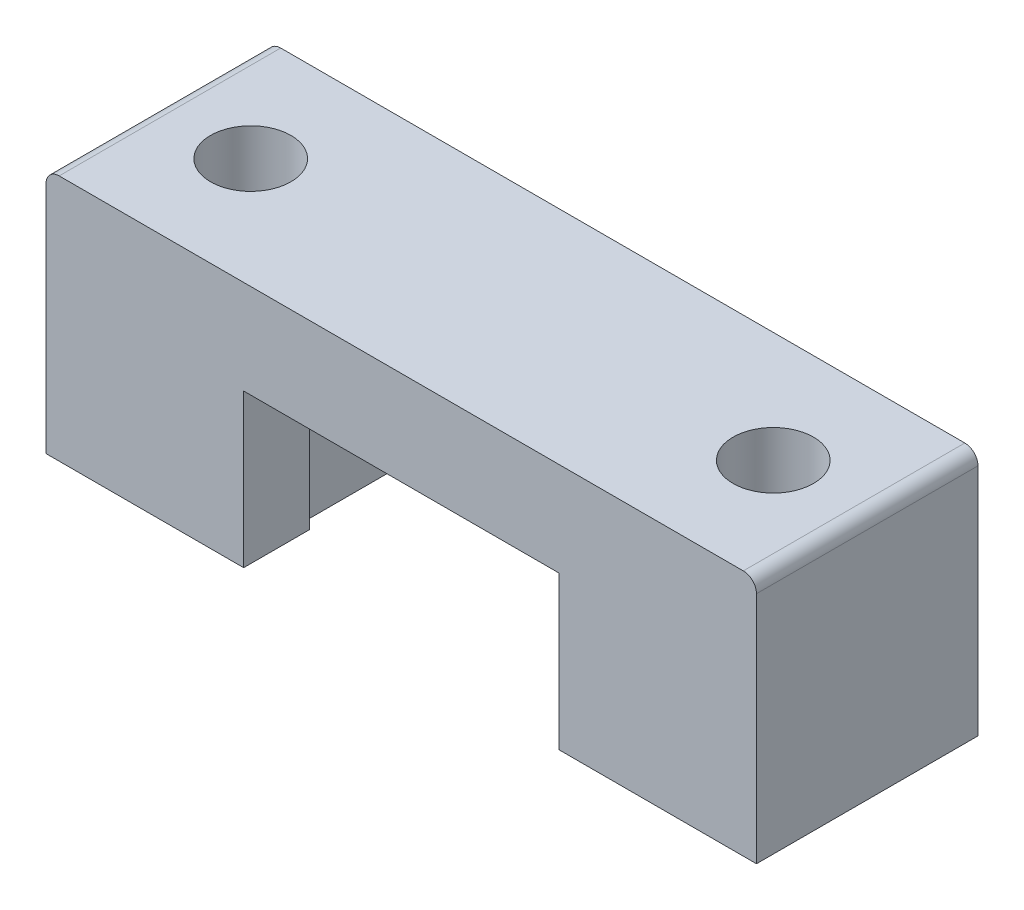
ISO-10303-21;
HEADER;
FILE_DESCRIPTION(('STEP AP214'),'2;1');
FILE_NAME('part.step','',(''),(''),'','','');
FILE_SCHEMA(('AUTOMOTIVE_DESIGN { 1 0 10303 214 1 1 1 1 }'));
ENDSEC;
DATA;
#1=APPLICATION_CONTEXT('core data for automotive mechanical design processes');
#2=APPLICATION_PROTOCOL_DEFINITION('international standard','automotive_design',2000,#1);
#3=PRODUCT_CONTEXT('',#1,'mechanical');
#4=PRODUCT('Part','Part','',(#3));
#5=PRODUCT_RELATED_PRODUCT_CATEGORY('part','',(#4));
#6=PRODUCT_DEFINITION_FORMATION('','',#4);
#7=PRODUCT_DEFINITION_CONTEXT('part definition',#1,'design');
#8=PRODUCT_DEFINITION('design','',#6,#7);
#9=PRODUCT_DEFINITION_SHAPE('','',#8);
#10=(LENGTH_UNIT() NAMED_UNIT(*) SI_UNIT(.MILLI.,.METRE.));
#11=(NAMED_UNIT(*) PLANE_ANGLE_UNIT() SI_UNIT($,.RADIAN.));
#12=(NAMED_UNIT(*) SI_UNIT($,.STERADIAN.) SOLID_ANGLE_UNIT());
#13=UNCERTAINTY_MEASURE_WITH_UNIT(LENGTH_MEASURE(1.E-05),#10,'distance_accuracy_value','');
#14=(GEOMETRIC_REPRESENTATION_CONTEXT(3) GLOBAL_UNCERTAINTY_ASSIGNED_CONTEXT((#13)) GLOBAL_UNIT_ASSIGNED_CONTEXT((#10,
#11,#12)) REPRESENTATION_CONTEXT('',''));
#15=CARTESIAN_POINT('',(0.,0.,0.));
#16=DIRECTION('',(0.,0.,1.));
#17=DIRECTION('',(1.,0.,0.));
#18=AXIS2_PLACEMENT_3D('',#15,#16,#17);
#19=CARTESIAN_POINT('',(0.,9.525,0.));
#20=DIRECTION('',(0.,0.,1.));
#21=DIRECTION('',(1.,0.,0.));
#22=AXIS2_PLACEMENT_3D('',#19,#20,#21);
#23=PLANE('',#22);
#24=DIRECTION('',(0.,-1.,0.));
#25=VECTOR('',#24,1.);
#26=CARTESIAN_POINT('',(-7.245,9.525,0.));
#27=LINE('',#26,#25);
#28=CARTESIAN_POINT('',(-7.245,9.017,0.));
#29=VERTEX_POINT('',#28);
#30=CARTESIAN_POINT('',(-7.245,0.,0.));
#31=VERTEX_POINT('',#30);
#32=EDGE_CURVE('E229',#29,#31,#27,.T.);
#33=ORIENTED_EDGE('',*,*,#32,.F.);
#34=CARTESIAN_POINT('',(-6.737,9.017,0.));
#35=DIRECTION('',(0.,0.,1.));
#36=DIRECTION('',(1.,0.,0.));
#37=AXIS2_PLACEMENT_3D('',#34,#35,#36);
#38=CIRCLE('',#37,0.508);
#39=CARTESIAN_POINT('',(-6.737,9.525,0.));
#40=VERTEX_POINT('',#39);
#41=EDGE_CURVE('E55',#29,#40,#38,.F.);
#42=ORIENTED_EDGE('',*,*,#41,.T.);
#43=DIRECTION('',(-1.,0.,0.));
#44=VECTOR('',#43,1.);
#45=CARTESIAN_POINT('',(0.,9.525,0.));
#46=LINE('',#45,#44);
#47=CARTESIAN_POINT('',(19.637,9.525,0.));
#48=VERTEX_POINT('',#47);
#49=EDGE_CURVE('E188',#48,#40,#46,.T.);
#50=ORIENTED_EDGE('',*,*,#49,.F.);
#51=CARTESIAN_POINT('',(19.637,9.017,0.));
#52=DIRECTION('',(0.,0.,1.));
#53=DIRECTION('',(1.,0.,0.));
#54=AXIS2_PLACEMENT_3D('',#51,#52,#53);
#55=CIRCLE('',#54,0.508);
#56=CARTESIAN_POINT('',(20.145,9.017,0.));
#57=VERTEX_POINT('',#56);
#58=EDGE_CURVE('E62',#48,#57,#55,.F.);
#59=ORIENTED_EDGE('',*,*,#58,.T.);
#60=DIRECTION('',(0.,-1.,0.));
#61=VECTOR('',#60,1.);
#62=CARTESIAN_POINT('',(20.145,9.525,0.));
#63=LINE('',#62,#61);
#64=CARTESIAN_POINT('',(20.145,0.,0.));
#65=VERTEX_POINT('',#64);
#66=EDGE_CURVE('E232',#57,#65,#63,.T.);
#67=ORIENTED_EDGE('',*,*,#66,.T.);
#68=DIRECTION('',(-1.,0.,0.));
#69=VECTOR('',#68,1.);
#70=CARTESIAN_POINT('',(0.,0.,0.));
#71=LINE('',#70,#69);
#72=CARTESIAN_POINT('',(12.9,0.,0.));
#73=VERTEX_POINT('',#72);
#74=EDGE_CURVE('E174',#65,#73,#71,.T.);
#75=ORIENTED_EDGE('',*,*,#74,.T.);
#76=DIRECTION('',(0.,-1.,0.));
#77=VECTOR('',#76,1.);
#78=CARTESIAN_POINT('',(12.9,5.9,0.));
#79=LINE('',#78,#77);
#80=CARTESIAN_POINT('',(12.9,5.9,0.));
#81=VERTEX_POINT('',#80);
#82=EDGE_CURVE('E165',#81,#73,#79,.T.);
#83=ORIENTED_EDGE('',*,*,#82,.F.);
#84=DIRECTION('',(-1.,0.,0.));
#85=VECTOR('',#84,1.);
#86=CARTESIAN_POINT('',(0.,5.9,0.));
#87=LINE('',#86,#85);
#88=CARTESIAN_POINT('',(0.,5.9,0.));
#89=VERTEX_POINT('',#88);
#90=EDGE_CURVE('E151',#81,#89,#87,.T.);
#91=ORIENTED_EDGE('',*,*,#90,.T.);
#92=DIRECTION('',(0.,-1.,0.));
#93=VECTOR('',#92,1.);
#94=CARTESIAN_POINT('',(0.,5.9,0.));
#95=LINE('',#94,#93);
#96=CARTESIAN_POINT('',(0.,0.,0.));
#97=VERTEX_POINT('',#96);
#98=EDGE_CURVE('E177',#89,#97,#95,.T.);
#99=ORIENTED_EDGE('',*,*,#98,.T.);
#100=EDGE_CURVE('E182',#97,#31,#71,.T.);
#101=ORIENTED_EDGE('',*,*,#100,.T.);
#102=EDGE_LOOP('',(#33,#42,#50,#59,#67,#75,#83,#91,#99,#101));
#103=FACE_BOUND('',#102,.T.);
#104=ADVANCED_FACE('F46',(#103),#23,.F.);
#105=CARTESIAN_POINT('',(0.,9.525,8.54));
#106=DIRECTION('',(0.,0.,-1.));
#107=DIRECTION('',(-1.,0.,0.));
#108=AXIS2_PLACEMENT_3D('',#105,#106,#107);
#109=PLANE('',#108);
#110=DIRECTION('',(1.,0.,0.));
#111=VECTOR('',#110,1.);
#112=CARTESIAN_POINT('',(0.,9.525,8.54));
#113=LINE('',#112,#111);
#114=CARTESIAN_POINT('',(-6.737,9.525,8.54));
#115=VERTEX_POINT('',#114);
#116=CARTESIAN_POINT('',(19.637,9.525,8.54));
#117=VERTEX_POINT('',#116);
#118=EDGE_CURVE('E192',#115,#117,#113,.T.);
#119=ORIENTED_EDGE('',*,*,#118,.F.);
#120=CARTESIAN_POINT('',(-6.737,9.017,8.54));
#121=DIRECTION('',(0.,0.,-1.));
#122=DIRECTION('',(-1.,0.,0.));
#123=AXIS2_PLACEMENT_3D('',#120,#121,#122);
#124=CIRCLE('',#123,0.508);
#125=CARTESIAN_POINT('',(-7.245,9.017,8.54));
#126=VERTEX_POINT('',#125);
#127=EDGE_CURVE('E245',#115,#126,#124,.F.);
#128=ORIENTED_EDGE('',*,*,#127,.T.);
#129=DIRECTION('',(0.,-1.,0.));
#130=VECTOR('',#129,1.);
#131=CARTESIAN_POINT('',(-7.245,9.525,8.54));
#132=LINE('',#131,#130);
#133=CARTESIAN_POINT('',(-7.245,0.,8.54));
#134=VERTEX_POINT('',#133);
#135=EDGE_CURVE('E226',#126,#134,#132,.T.);
#136=ORIENTED_EDGE('',*,*,#135,.T.);
#137=DIRECTION('',(1.,0.,0.));
#138=VECTOR('',#137,1.);
#139=CARTESIAN_POINT('',(0.,0.,8.54));
#140=LINE('',#139,#138);
#141=CARTESIAN_POINT('',(0.375000000000001,0.,8.54));
#142=VERTEX_POINT('',#141);
#143=EDGE_CURVE('E213',#134,#142,#140,.T.);
#144=ORIENTED_EDGE('',*,*,#143,.T.);
#145=DIRECTION('',(0.,-1.,0.));
#146=VECTOR('',#145,1.);
#147=CARTESIAN_POINT('',(0.375000000000001,5.9,8.54));
#148=LINE('',#147,#146);
#149=CARTESIAN_POINT('',(0.375000000000001,5.9,8.54));
#150=VERTEX_POINT('',#149);
#151=EDGE_CURVE('E277',#150,#142,#148,.T.);
#152=ORIENTED_EDGE('',*,*,#151,.F.);
#153=DIRECTION('',(1.,0.,0.));
#154=VECTOR('',#153,1.);
#155=CARTESIAN_POINT('',(0.,5.9,8.54));
#156=LINE('',#155,#154);
#157=CARTESIAN_POINT('',(12.525,5.9,8.54));
#158=VERTEX_POINT('',#157);
#159=EDGE_CURVE('E280',#150,#158,#156,.T.);
#160=ORIENTED_EDGE('',*,*,#159,.T.);
#161=DIRECTION('',(0.,-1.,0.));
#162=VECTOR('',#161,1.);
#163=CARTESIAN_POINT('',(12.525,5.9,8.54));
#164=LINE('',#163,#162);
#165=CARTESIAN_POINT('',(12.525,0.,8.54));
#166=VERTEX_POINT('',#165);
#167=EDGE_CURVE('E284',#158,#166,#164,.T.);
#168=ORIENTED_EDGE('',*,*,#167,.T.);
#169=CARTESIAN_POINT('',(20.145,0.,8.54));
#170=VERTEX_POINT('',#169);
#171=EDGE_CURVE('E212',#166,#170,#140,.T.);
#172=ORIENTED_EDGE('',*,*,#171,.T.);
#173=DIRECTION('',(0.,-1.,0.));
#174=VECTOR('',#173,1.);
#175=CARTESIAN_POINT('',(20.145,9.525,8.54));
#176=LINE('',#175,#174);
#177=CARTESIAN_POINT('',(20.145,9.017,8.54));
#178=VERTEX_POINT('',#177);
#179=EDGE_CURVE('E204',#178,#170,#176,.T.);
#180=ORIENTED_EDGE('',*,*,#179,.F.);
#181=CARTESIAN_POINT('',(19.637,9.017,8.54));
#182=DIRECTION('',(0.,0.,-1.));
#183=DIRECTION('',(-1.,0.,0.));
#184=AXIS2_PLACEMENT_3D('',#181,#182,#183);
#185=CIRCLE('',#184,0.508);
#186=EDGE_CURVE('E242',#178,#117,#185,.F.);
#187=ORIENTED_EDGE('',*,*,#186,.T.);
#188=EDGE_LOOP('',(#119,#128,#136,#144,#152,#160,#168,#172,#180,#187));
#189=FACE_BOUND('',#188,.T.);
#190=ADVANCED_FACE('F263',(#189),#109,.F.);
#191=CARTESIAN_POINT('',(0.,0.,0.));
#192=DIRECTION('',(0.,1.,0.));
#193=DIRECTION('',(0.,0.,1.));
#194=AXIS2_PLACEMENT_3D('',#191,#192,#193);
#195=PLANE('',#194);
#196=CARTESIAN_POINT('',(-3.6225,0.,4.27));
#197=DIRECTION('',(0.,1.,0.));
#198=DIRECTION('',(0.,0.,1.));
#199=AXIS2_PLACEMENT_3D('',#196,#197,#198);
#200=CIRCLE('',#199,1.55);
#201=CARTESIAN_POINT('',(-3.6225,0.,2.72));
#202=VERTEX_POINT('',#201);
#203=EDGE_CURVE('E217',#202,#202,#200,.T.);
#204=ORIENTED_EDGE('',*,*,#203,.T.);
#205=EDGE_LOOP('',(#204));
#206=FACE_BOUND('',#205,.T.);
#207=DIRECTION('',(0.,0.,1.));
#208=VECTOR('',#207,1.);
#209=CARTESIAN_POINT('',(0.,0.,0.));
#210=LINE('',#209,#208);
#211=CARTESIAN_POINT('',(0.,0.,6.));
#212=VERTEX_POINT('',#211);
#213=EDGE_CURVE('E297',#97,#212,#210,.T.);
#214=ORIENTED_EDGE('',*,*,#213,.T.);
#215=DIRECTION('',(1.,0.,0.));
#216=VECTOR('',#215,1.);
#217=CARTESIAN_POINT('',(0.,0.,6.));
#218=LINE('',#217,#216);
#219=CARTESIAN_POINT('',(0.375000000000001,0.,6.));
#220=VERTEX_POINT('',#219);
#221=EDGE_CURVE('E299',#212,#220,#218,.T.);
#222=ORIENTED_EDGE('',*,*,#221,.T.);
#223=DIRECTION('',(0.,0.,1.));
#224=VECTOR('',#223,1.);
#225=CARTESIAN_POINT('',(0.375,0.,0.));
#226=LINE('',#225,#224);
#227=EDGE_CURVE('E274',#220,#142,#226,.T.);
#228=ORIENTED_EDGE('',*,*,#227,.T.);
#229=ORIENTED_EDGE('',*,*,#143,.F.);
#230=DIRECTION('',(0.,0.,1.));
#231=VECTOR('',#230,1.);
#232=CARTESIAN_POINT('',(-7.245,0.,0.));
#233=LINE('',#232,#231);
#234=EDGE_CURVE('E208',#31,#134,#233,.T.);
#235=ORIENTED_EDGE('',*,*,#234,.F.);
#236=ORIENTED_EDGE('',*,*,#100,.F.);
#237=EDGE_LOOP('',(#214,#222,#228,#229,#235,#236));
#238=FACE_BOUND('',#237,.T.);
#239=ADVANCED_FACE('F271',(#206,#238),#195,.F.);
#240=CARTESIAN_POINT('',(16.5225,0.,4.27));
#241=DIRECTION('',(0.,1.,0.));
#242=DIRECTION('',(0.,0.,1.));
#243=AXIS2_PLACEMENT_3D('',#240,#241,#242);
#244=CIRCLE('',#243,1.55);
#245=CARTESIAN_POINT('',(16.5225,0.,2.72));
#246=VERTEX_POINT('',#245);
#247=EDGE_CURVE('E193',#246,#246,#244,.T.);
#248=ORIENTED_EDGE('',*,*,#247,.T.);
#249=EDGE_LOOP('',(#248));
#250=FACE_BOUND('',#249,.T.);
#251=DIRECTION('',(0.,0.,-1.));
#252=VECTOR('',#251,1.);
#253=CARTESIAN_POINT('',(12.9,0.,0.));
#254=LINE('',#253,#252);
#255=CARTESIAN_POINT('',(12.9,0.,6.));
#256=VERTEX_POINT('',#255);
#257=EDGE_CURVE('E305',#256,#73,#254,.T.);
#258=ORIENTED_EDGE('',*,*,#257,.T.);
#259=ORIENTED_EDGE('',*,*,#74,.F.);
#260=DIRECTION('',(0.,0.,1.));
#261=VECTOR('',#260,1.);
#262=CARTESIAN_POINT('',(20.145,0.,0.));
#263=LINE('',#262,#261);
#264=EDGE_CURVE('E176',#65,#170,#263,.T.);
#265=ORIENTED_EDGE('',*,*,#264,.T.);
#266=ORIENTED_EDGE('',*,*,#171,.F.);
#267=DIRECTION('',(0.,0.,-1.));
#268=VECTOR('',#267,1.);
#269=CARTESIAN_POINT('',(12.525,0.,0.));
#270=LINE('',#269,#268);
#271=CARTESIAN_POINT('',(12.525,0.,6.));
#272=VERTEX_POINT('',#271);
#273=EDGE_CURVE('E313',#166,#272,#270,.T.);
#274=ORIENTED_EDGE('',*,*,#273,.T.);
#275=DIRECTION('',(1.,0.,0.));
#276=VECTOR('',#275,1.);
#277=CARTESIAN_POINT('',(0.,0.,6.00000000000006));
#278=LINE('',#277,#276);
#279=EDGE_CURVE('E170',#272,#256,#278,.T.);
#280=ORIENTED_EDGE('',*,*,#279,.T.);
#281=EDGE_LOOP('',(#258,#259,#265,#266,#274,#280));
#282=FACE_BOUND('',#281,.T.);
#283=ADVANCED_FACE('F333',(#250,#282),#195,.F.);
#284=CARTESIAN_POINT('',(20.145,9.525,0.));
#285=DIRECTION('',(1.,0.,0.));
#286=DIRECTION('',(0.,0.,-1.));
#287=AXIS2_PLACEMENT_3D('',#284,#285,#286);
#288=PLANE('',#287);
#289=ORIENTED_EDGE('',*,*,#66,.F.);
#290=DIRECTION('',(0.,0.,1.));
#291=VECTOR('',#290,1.);
#292=CARTESIAN_POINT('',(20.145,9.017,0.));
#293=LINE('',#292,#291);
#294=EDGE_CURVE('E11',#57,#178,#293,.T.);
#295=ORIENTED_EDGE('',*,*,#294,.T.);
#296=ORIENTED_EDGE('',*,*,#179,.T.);
#297=ORIENTED_EDGE('',*,*,#264,.F.);
#298=EDGE_LOOP('',(#289,#295,#296,#297));
#299=FACE_BOUND('',#298,.T.);
#300=ADVANCED_FACE('F371',(#299),#288,.T.);
#301=CARTESIAN_POINT('',(-7.245,9.525,0.));
#302=DIRECTION('',(1.,0.,0.));
#303=DIRECTION('',(0.,0.,-1.));
#304=AXIS2_PLACEMENT_3D('',#301,#302,#303);
#305=PLANE('',#304);
#306=ORIENTED_EDGE('',*,*,#135,.F.);
#307=DIRECTION('',(0.,0.,1.));
#308=VECTOR('',#307,1.);
#309=CARTESIAN_POINT('',(-7.245,9.017,0.));
#310=LINE('',#309,#308);
#311=EDGE_CURVE('E70',#126,#29,#310,.F.);
#312=ORIENTED_EDGE('',*,*,#311,.T.);
#313=ORIENTED_EDGE('',*,*,#32,.T.);
#314=ORIENTED_EDGE('',*,*,#234,.T.);
#315=EDGE_LOOP('',(#306,#312,#313,#314));
#316=FACE_BOUND('',#315,.T.);
#317=ADVANCED_FACE('F264',(#316),#305,.F.);
#318=CARTESIAN_POINT('',(-3.6225,9.525,4.27));
#319=DIRECTION('',(0.,-1.,0.));
#320=DIRECTION('',(0.,0.,-1.));
#321=AXIS2_PLACEMENT_3D('',#318,#319,#320);
#322=CYLINDRICAL_SURFACE('',#321,1.55);
#323=CARTESIAN_POINT('',(-3.6225,9.525,4.27));
#324=DIRECTION('',(0.,1.,0.));
#325=DIRECTION('',(0.,0.,1.));
#326=AXIS2_PLACEMENT_3D('',#323,#324,#325);
#327=CIRCLE('',#326,1.55);
#328=CARTESIAN_POINT('',(-3.6225,9.525,2.72));
#329=VERTEX_POINT('',#328);
#330=EDGE_CURVE('E197',#329,#329,#327,.T.);
#331=CARTESIAN_POINT('',(-3.6225,9.525,2.72));
#332=CARTESIAN_POINT('',(-3.6225,9.42578125,2.72));
#333=CARTESIAN_POINT('',(-3.6225,9.3265625,2.72));
#334=CARTESIAN_POINT('',(-3.6225,9.128125,2.72));
#335=CARTESIAN_POINT('',(-3.6225,9.02890625,2.72));
#336=CARTESIAN_POINT('',(-3.6225,8.83046875,2.72));
#337=CARTESIAN_POINT('',(-3.6225,8.73125,2.72));
#338=CARTESIAN_POINT('',(-3.6225,8.5328125,2.72));
#339=CARTESIAN_POINT('',(-3.6225,8.43359375,2.72));
#340=CARTESIAN_POINT('',(-3.6225,8.23515625,2.72));
#341=CARTESIAN_POINT('',(-3.6225,8.1359375,2.72));
#342=CARTESIAN_POINT('',(-3.6225,7.9375,2.72));
#343=CARTESIAN_POINT('',(-3.6225,7.83828125,2.72));
#344=CARTESIAN_POINT('',(-3.6225,7.63984375,2.72));
#345=CARTESIAN_POINT('',(-3.6225,7.540625,2.72));
#346=CARTESIAN_POINT('',(-3.6225,7.3421875,2.72));
#347=CARTESIAN_POINT('',(-3.6225,7.24296875,2.72));
#348=CARTESIAN_POINT('',(-3.6225,7.04453125,2.72));
#349=CARTESIAN_POINT('',(-3.6225,6.9453125,2.72));
#350=CARTESIAN_POINT('',(-3.6225,6.746875,2.72));
#351=CARTESIAN_POINT('',(-3.6225,6.64765625,2.72));
#352=CARTESIAN_POINT('',(-3.6225,6.44921875,2.72));
#353=CARTESIAN_POINT('',(-3.6225,6.35,2.72));
#354=CARTESIAN_POINT('',(-3.6225,6.1515625,2.72));
#355=CARTESIAN_POINT('',(-3.6225,6.05234375,2.72));
#356=CARTESIAN_POINT('',(-3.6225,5.85390625,2.72));
#357=CARTESIAN_POINT('',(-3.6225,5.7546875,2.72));
#358=CARTESIAN_POINT('',(-3.6225,5.55625,2.72));
#359=CARTESIAN_POINT('',(-3.6225,5.45703125,2.72));
#360=CARTESIAN_POINT('',(-3.6225,5.25859375,2.72));
#361=CARTESIAN_POINT('',(-3.6225,5.159375,2.72));
#362=CARTESIAN_POINT('',(-3.6225,4.9609375,2.72));
#363=CARTESIAN_POINT('',(-3.6225,4.86171875,2.72));
#364=CARTESIAN_POINT('',(-3.6225,4.66328125,2.72));
#365=CARTESIAN_POINT('',(-3.6225,4.5640625,2.72));
#366=CARTESIAN_POINT('',(-3.6225,4.365625,2.72));
#367=CARTESIAN_POINT('',(-3.6225,4.26640625,2.72));
#368=CARTESIAN_POINT('',(-3.6225,4.06796875,2.72));
#369=CARTESIAN_POINT('',(-3.6225,3.96875,2.72));
#370=CARTESIAN_POINT('',(-3.6225,3.7703125,2.72));
#371=CARTESIAN_POINT('',(-3.6225,3.67109375,2.72));
#372=CARTESIAN_POINT('',(-3.6225,3.47265625,2.72));
#373=CARTESIAN_POINT('',(-3.6225,3.3734375,2.72));
#374=CARTESIAN_POINT('',(-3.6225,3.175,2.72));
#375=CARTESIAN_POINT('',(-3.6225,3.07578125,2.72));
#376=CARTESIAN_POINT('',(-3.6225,2.87734375,2.72));
#377=CARTESIAN_POINT('',(-3.6225,2.778125,2.72));
#378=CARTESIAN_POINT('',(-3.6225,2.5796875,2.72));
#379=CARTESIAN_POINT('',(-3.6225,2.48046875,2.72));
#380=CARTESIAN_POINT('',(-3.6225,2.28203125,2.72));
#381=CARTESIAN_POINT('',(-3.6225,2.1828125,2.72));
#382=CARTESIAN_POINT('',(-3.6225,1.984375,2.72));
#383=CARTESIAN_POINT('',(-3.6225,1.88515625,2.72));
#384=CARTESIAN_POINT('',(-3.6225,1.68671875,2.72));
#385=CARTESIAN_POINT('',(-3.6225,1.5875,2.72));
#386=CARTESIAN_POINT('',(-3.6225,1.3890625,2.72));
#387=CARTESIAN_POINT('',(-3.6225,1.28984375,2.72));
#388=CARTESIAN_POINT('',(-3.6225,1.09140625,2.72));
#389=CARTESIAN_POINT('',(-3.6225,0.992187500000001,2.72));
#390=CARTESIAN_POINT('',(-3.6225,0.793750000000001,2.72));
#391=CARTESIAN_POINT('',(-3.6225,0.69453125,2.72));
#392=CARTESIAN_POINT('',(-3.6225,0.49609375,2.72));
#393=CARTESIAN_POINT('',(-3.6225,0.396875,2.72));
#394=CARTESIAN_POINT('',(-3.6225,0.1984375,2.72));
#395=CARTESIAN_POINT('',(-3.6225,0.0992187500000001,2.72));
#396=CARTESIAN_POINT('',(-3.6225,0.,2.72));
#397=B_SPLINE_CURVE_WITH_KNOTS('',3,(#331,#332,#333,#334,#335,#336,#337,#338,#339,#340,#341,
#342,#343,#344,#345,#346,#347,#348,#349,#350,#351,#352,#353,#354,#355,#356,#357,#358,#359,#360,
#361,#362,#363,#364,#365,#366,#367,#368,#369,#370,#371,#372,#373,#374,#375,#376,#377,#378,#379,
#380,#381,#382,#383,#384,#385,#386,#387,#388,#389,#390,#391,#392,#393,#394,#395,#396),
.UNSPECIFIED.,.F.,.F.,(4,2,2,2,2,2,2,2,2,2,2,2,2,2,2,2,2,2,2,2,2,2,2,2,2,2,2,2,2,2,2,2,4),(0.,
0.297656249999998,0.595312499999999,0.892968749999999,1.190625,1.48828125,1.7859375,2.08359375,
2.38125,2.67890625,2.9765625,3.27421875,3.571875,3.86953125,4.1671875,4.46484375,4.7625,
5.06015625,5.3578125,5.65546875,5.953125,6.25078125,6.5484375,6.84609375,7.14375,7.44140625,
7.7390625,8.03671875,8.334375,8.63203125,8.9296875,9.22734375,9.525),.UNSPECIFIED.);
#398=EDGE_CURVE('BSEAM471',#329,#202,#397,.T.);
#399=ORIENTED_EDGE('',*,*,#330,.T.);
#400=ORIENTED_EDGE('',*,*,#203,.F.);
#401=ORIENTED_EDGE('',*,*,#398,.T.);
#402=ORIENTED_EDGE('',*,*,#398,.F.);
#403=EDGE_LOOP('',(#399,#401,#400,#402));
#404=FACE_BOUND('',#403,.T.);
#405=ADVANCED_FACE('F471',(#404),#322,.F.);
#406=CARTESIAN_POINT('',(16.5225,9.525,4.27));
#407=DIRECTION('',(0.,-1.,0.));
#408=DIRECTION('',(0.,0.,-1.));
#409=AXIS2_PLACEMENT_3D('',#406,#407,#408);
#410=CYLINDRICAL_SURFACE('',#409,1.55);
#411=CARTESIAN_POINT('',(16.5225,9.525,4.27));
#412=DIRECTION('',(0.,1.,0.));
#413=DIRECTION('',(0.,0.,1.));
#414=AXIS2_PLACEMENT_3D('',#411,#412,#413);
#415=CIRCLE('',#414,1.55);
#416=CARTESIAN_POINT('',(16.5225,9.525,2.72));
#417=VERTEX_POINT('',#416);
#418=EDGE_CURVE('E201',#417,#417,#415,.T.);
#419=CARTESIAN_POINT('',(16.5225,9.525,2.72));
#420=CARTESIAN_POINT('',(16.5225,9.42578125,2.72));
#421=CARTESIAN_POINT('',(16.5225,9.3265625,2.72));
#422=CARTESIAN_POINT('',(16.5225,9.128125,2.72));
#423=CARTESIAN_POINT('',(16.5225,9.02890625,2.72));
#424=CARTESIAN_POINT('',(16.5225,8.83046875,2.72));
#425=CARTESIAN_POINT('',(16.5225,8.73125,2.72));
#426=CARTESIAN_POINT('',(16.5225,8.5328125,2.72));
#427=CARTESIAN_POINT('',(16.5225,8.43359375,2.72));
#428=CARTESIAN_POINT('',(16.5225,8.23515625,2.72));
#429=CARTESIAN_POINT('',(16.5225,8.1359375,2.72));
#430=CARTESIAN_POINT('',(16.5225,7.9375,2.72));
#431=CARTESIAN_POINT('',(16.5225,7.83828125,2.72));
#432=CARTESIAN_POINT('',(16.5225,7.63984375,2.72));
#433=CARTESIAN_POINT('',(16.5225,7.540625,2.72));
#434=CARTESIAN_POINT('',(16.5225,7.3421875,2.72));
#435=CARTESIAN_POINT('',(16.5225,7.24296875,2.72));
#436=CARTESIAN_POINT('',(16.5225,7.04453125,2.72));
#437=CARTESIAN_POINT('',(16.5225,6.9453125,2.72));
#438=CARTESIAN_POINT('',(16.5225,6.746875,2.72));
#439=CARTESIAN_POINT('',(16.5225,6.64765625,2.72));
#440=CARTESIAN_POINT('',(16.5225,6.44921875,2.72));
#441=CARTESIAN_POINT('',(16.5225,6.35,2.72));
#442=CARTESIAN_POINT('',(16.5225,6.1515625,2.72));
#443=CARTESIAN_POINT('',(16.5225,6.05234375,2.72));
#444=CARTESIAN_POINT('',(16.5225,5.85390625,2.72));
#445=CARTESIAN_POINT('',(16.5225,5.7546875,2.72));
#446=CARTESIAN_POINT('',(16.5225,5.55625,2.72));
#447=CARTESIAN_POINT('',(16.5225,5.45703125,2.72));
#448=CARTESIAN_POINT('',(16.5225,5.25859375,2.72));
#449=CARTESIAN_POINT('',(16.5225,5.159375,2.72));
#450=CARTESIAN_POINT('',(16.5225,4.9609375,2.72));
#451=CARTESIAN_POINT('',(16.5225,4.86171875,2.72));
#452=CARTESIAN_POINT('',(16.5225,4.66328125,2.72));
#453=CARTESIAN_POINT('',(16.5225,4.5640625,2.72));
#454=CARTESIAN_POINT('',(16.5225,4.365625,2.72));
#455=CARTESIAN_POINT('',(16.5225,4.26640625,2.72));
#456=CARTESIAN_POINT('',(16.5225,4.06796875,2.72));
#457=CARTESIAN_POINT('',(16.5225,3.96875,2.72));
#458=CARTESIAN_POINT('',(16.5225,3.7703125,2.72));
#459=CARTESIAN_POINT('',(16.5225,3.67109375,2.72));
#460=CARTESIAN_POINT('',(16.5225,3.47265625,2.72));
#461=CARTESIAN_POINT('',(16.5225,3.3734375,2.72));
#462=CARTESIAN_POINT('',(16.5225,3.175,2.72));
#463=CARTESIAN_POINT('',(16.5225,3.07578125,2.72));
#464=CARTESIAN_POINT('',(16.5225,2.87734375,2.72));
#465=CARTESIAN_POINT('',(16.5225,2.778125,2.72));
#466=CARTESIAN_POINT('',(16.5225,2.5796875,2.72));
#467=CARTESIAN_POINT('',(16.5225,2.48046875,2.72));
#468=CARTESIAN_POINT('',(16.5225,2.28203125,2.72));
#469=CARTESIAN_POINT('',(16.5225,2.1828125,2.72));
#470=CARTESIAN_POINT('',(16.5225,1.984375,2.72));
#471=CARTESIAN_POINT('',(16.5225,1.88515625,2.72));
#472=CARTESIAN_POINT('',(16.5225,1.68671875,2.72));
#473=CARTESIAN_POINT('',(16.5225,1.5875,2.72));
#474=CARTESIAN_POINT('',(16.5225,1.3890625,2.72));
#475=CARTESIAN_POINT('',(16.5225,1.28984375,2.72));
#476=CARTESIAN_POINT('',(16.5225,1.09140625,2.72));
#477=CARTESIAN_POINT('',(16.5225,0.992187500000001,2.72));
#478=CARTESIAN_POINT('',(16.5225,0.793750000000001,2.72));
#479=CARTESIAN_POINT('',(16.5225,0.69453125,2.72));
#480=CARTESIAN_POINT('',(16.5225,0.49609375,2.72));
#481=CARTESIAN_POINT('',(16.5225,0.396875,2.72));
#482=CARTESIAN_POINT('',(16.5225,0.1984375,2.72));
#483=CARTESIAN_POINT('',(16.5225,0.0992187500000001,2.72));
#484=CARTESIAN_POINT('',(16.5225,0.,2.72));
#485=B_SPLINE_CURVE_WITH_KNOTS('',3,(#419,#420,#421,#422,#423,#424,#425,#426,#427,#428,#429,
#430,#431,#432,#433,#434,#435,#436,#437,#438,#439,#440,#441,#442,#443,#444,#445,#446,#447,#448,
#449,#450,#451,#452,#453,#454,#455,#456,#457,#458,#459,#460,#461,#462,#463,#464,#465,#466,#467,
#468,#469,#470,#471,#472,#473,#474,#475,#476,#477,#478,#479,#480,#481,#482,#483,#484),
.UNSPECIFIED.,.F.,.F.,(4,2,2,2,2,2,2,2,2,2,2,2,2,2,2,2,2,2,2,2,2,2,2,2,2,2,2,2,2,2,2,2,4),(0.,
0.297656249999998,0.595312499999999,0.892968749999999,1.190625,1.48828125,1.7859375,2.08359375,
2.38125,2.67890625,2.9765625,3.27421875,3.571875,3.86953125,4.1671875,4.46484375,4.7625,
5.06015625,5.3578125,5.65546875,5.953125,6.25078125,6.5484375,6.84609375,7.14375,7.44140625,
7.7390625,8.03671875,8.334375,8.63203125,8.9296875,9.22734375,9.525),.UNSPECIFIED.);
#486=EDGE_CURVE('BSEAM463',#417,#246,#485,.T.);
#487=ORIENTED_EDGE('',*,*,#418,.T.);
#488=ORIENTED_EDGE('',*,*,#247,.F.);
#489=ORIENTED_EDGE('',*,*,#486,.T.);
#490=ORIENTED_EDGE('',*,*,#486,.F.);
#491=EDGE_LOOP('',(#487,#489,#488,#490));
#492=FACE_BOUND('',#491,.T.);
#493=ADVANCED_FACE('F463',(#492),#410,.F.);
#494=CARTESIAN_POINT('',(0.,9.525,0.));
#495=DIRECTION('',(0.,1.,0.));
#496=DIRECTION('',(0.,0.,1.));
#497=AXIS2_PLACEMENT_3D('',#494,#495,#496);
#498=PLANE('',#497);
#499=ORIENTED_EDGE('',*,*,#49,.T.);
#500=DIRECTION('',(0.,0.,1.));
#501=VECTOR('',#500,1.);
#502=CARTESIAN_POINT('',(-6.737,9.525,8.54));
#503=LINE('',#502,#501);
#504=EDGE_CURVE('E238',#40,#115,#503,.T.);
#505=ORIENTED_EDGE('',*,*,#504,.T.);
#506=ORIENTED_EDGE('',*,*,#118,.T.);
#507=DIRECTION('',(0.,0.,1.));
#508=VECTOR('',#507,1.);
#509=CARTESIAN_POINT('',(19.637,9.525,0.));
#510=LINE('',#509,#508);
#511=EDGE_CURVE('E235',#117,#48,#510,.F.);
#512=ORIENTED_EDGE('',*,*,#511,.T.);
#513=EDGE_LOOP('',(#499,#505,#506,#512));
#514=FACE_BOUND('',#513,.T.);
#515=ORIENTED_EDGE('',*,*,#330,.F.);
#516=EDGE_LOOP('',(#515));
#517=FACE_BOUND('',#516,.T.);
#518=ORIENTED_EDGE('',*,*,#418,.F.);
#519=EDGE_LOOP('',(#518));
#520=FACE_BOUND('',#519,.T.);
#521=ADVANCED_FACE('F257',(#514,#517,#520),#498,.T.);
#522=CARTESIAN_POINT('',(12.9,5.9,0.));
#523=DIRECTION('',(-1.,0.,0.));
#524=DIRECTION('',(0.,0.,1.));
#525=AXIS2_PLACEMENT_3D('',#522,#523,#524);
#526=PLANE('',#525);
#527=ORIENTED_EDGE('',*,*,#257,.F.);
#528=DIRECTION('',(0.,-1.,0.));
#529=VECTOR('',#528,1.);
#530=CARTESIAN_POINT('',(12.9,5.9,6.));
#531=LINE('',#530,#529);
#532=CARTESIAN_POINT('',(12.9,5.9,6.));
#533=VERTEX_POINT('',#532);
#534=EDGE_CURVE('E168',#533,#256,#531,.T.);
#535=ORIENTED_EDGE('',*,*,#534,.F.);
#536=DIRECTION('',(0.,0.,-1.));
#537=VECTOR('',#536,1.);
#538=CARTESIAN_POINT('',(12.9,5.9,0.));
#539=LINE('',#538,#537);
#540=EDGE_CURVE('E155',#533,#81,#539,.T.);
#541=ORIENTED_EDGE('',*,*,#540,.T.);
#542=ORIENTED_EDGE('',*,*,#82,.T.);
#543=EDGE_LOOP('',(#527,#535,#541,#542));
#544=FACE_BOUND('',#543,.T.);
#545=ADVANCED_FACE('F164',(#544),#526,.T.);
#546=CARTESIAN_POINT('',(0.,5.9,0.));
#547=DIRECTION('',(1.,0.,0.));
#548=DIRECTION('',(0.,0.,-1.));
#549=AXIS2_PLACEMENT_3D('',#546,#547,#548);
#550=PLANE('',#549);
#551=ORIENTED_EDGE('',*,*,#213,.F.);
#552=ORIENTED_EDGE('',*,*,#98,.F.);
#553=DIRECTION('',(0.,0.,1.));
#554=VECTOR('',#553,1.);
#555=CARTESIAN_POINT('',(0.,5.9,0.));
#556=LINE('',#555,#554);
#557=CARTESIAN_POINT('',(0.,5.9,6.));
#558=VERTEX_POINT('',#557);
#559=EDGE_CURVE('E157',#89,#558,#556,.T.);
#560=ORIENTED_EDGE('',*,*,#559,.T.);
#561=DIRECTION('',(0.,-1.,0.));
#562=VECTOR('',#561,1.);
#563=CARTESIAN_POINT('',(0.,5.9,6.));
#564=LINE('',#563,#562);
#565=EDGE_CURVE('E184',#558,#212,#564,.T.);
#566=ORIENTED_EDGE('',*,*,#565,.T.);
#567=EDGE_LOOP('',(#551,#552,#560,#566));
#568=FACE_BOUND('',#567,.T.);
#569=ADVANCED_FACE('F296',(#568),#550,.T.);
#570=CARTESIAN_POINT('',(0.,5.9,6.));
#571=DIRECTION('',(0.,0.,-1.));
#572=DIRECTION('',(-1.,0.,0.));
#573=AXIS2_PLACEMENT_3D('',#570,#571,#572);
#574=PLANE('',#573);
#575=ORIENTED_EDGE('',*,*,#221,.F.);
#576=ORIENTED_EDGE('',*,*,#565,.F.);
#577=DIRECTION('',(1.,0.,0.));
#578=VECTOR('',#577,1.);
#579=CARTESIAN_POINT('',(0.,5.9,6.));
#580=LINE('',#579,#578);
#581=CARTESIAN_POINT('',(0.375000000000001,5.9,6.));
#582=VERTEX_POINT('',#581);
#583=EDGE_CURVE('E349',#558,#582,#580,.T.);
#584=ORIENTED_EDGE('',*,*,#583,.T.);
#585=DIRECTION('',(0.,-1.,0.));
#586=VECTOR('',#585,1.);
#587=CARTESIAN_POINT('',(0.375000000000001,5.9,6.));
#588=LINE('',#587,#586);
#589=EDGE_CURVE('E283',#582,#220,#588,.T.);
#590=ORIENTED_EDGE('',*,*,#589,.T.);
#591=EDGE_LOOP('',(#575,#576,#584,#590));
#592=FACE_BOUND('',#591,.T.);
#593=ADVANCED_FACE('F300',(#592),#574,.T.);
#594=CARTESIAN_POINT('',(0.375,5.9,0.));
#595=DIRECTION('',(1.,0.,0.));
#596=DIRECTION('',(0.,0.,-1.));
#597=AXIS2_PLACEMENT_3D('',#594,#595,#596);
#598=PLANE('',#597);
#599=ORIENTED_EDGE('',*,*,#227,.F.);
#600=ORIENTED_EDGE('',*,*,#589,.F.);
#601=DIRECTION('',(0.,0.,1.));
#602=VECTOR('',#601,1.);
#603=CARTESIAN_POINT('',(0.375,5.9,0.));
#604=LINE('',#603,#602);
#605=EDGE_CURVE('E344',#582,#150,#604,.T.);
#606=ORIENTED_EDGE('',*,*,#605,.T.);
#607=ORIENTED_EDGE('',*,*,#151,.T.);
#608=EDGE_LOOP('',(#599,#600,#606,#607));
#609=FACE_BOUND('',#608,.T.);
#610=ADVANCED_FACE('F353',(#609),#598,.T.);
#611=CARTESIAN_POINT('',(12.525,5.9,0.));
#612=DIRECTION('',(-1.,0.,0.));
#613=DIRECTION('',(0.,0.,1.));
#614=AXIS2_PLACEMENT_3D('',#611,#612,#613);
#615=PLANE('',#614);
#616=ORIENTED_EDGE('',*,*,#273,.F.);
#617=ORIENTED_EDGE('',*,*,#167,.F.);
#618=DIRECTION('',(0.,0.,-1.));
#619=VECTOR('',#618,1.);
#620=CARTESIAN_POINT('',(12.525,5.9,0.));
#621=LINE('',#620,#619);
#622=CARTESIAN_POINT('',(12.525,5.9,6.));
#623=VERTEX_POINT('',#622);
#624=EDGE_CURVE('E328',#158,#623,#621,.T.);
#625=ORIENTED_EDGE('',*,*,#624,.T.);
#626=DIRECTION('',(0.,-1.,0.));
#627=VECTOR('',#626,1.);
#628=CARTESIAN_POINT('',(12.525,5.9,6.));
#629=LINE('',#628,#627);
#630=EDGE_CURVE('E289',#623,#272,#629,.T.);
#631=ORIENTED_EDGE('',*,*,#630,.T.);
#632=EDGE_LOOP('',(#616,#617,#625,#631));
#633=FACE_BOUND('',#632,.T.);
#634=ADVANCED_FACE('F326',(#633),#615,.T.);
#635=CARTESIAN_POINT('',(0.,5.9,6.00000000000006));
#636=DIRECTION('',(0.,0.,-1.));
#637=DIRECTION('',(-1.,0.,0.));
#638=AXIS2_PLACEMENT_3D('',#635,#636,#637);
#639=PLANE('',#638);
#640=ORIENTED_EDGE('',*,*,#279,.F.);
#641=ORIENTED_EDGE('',*,*,#630,.F.);
#642=DIRECTION('',(1.,0.,0.));
#643=VECTOR('',#642,1.);
#644=CARTESIAN_POINT('',(0.,5.9,6.00000000000006));
#645=LINE('',#644,#643);
#646=EDGE_CURVE('E321',#623,#533,#645,.T.);
#647=ORIENTED_EDGE('',*,*,#646,.T.);
#648=ORIENTED_EDGE('',*,*,#534,.T.);
#649=EDGE_LOOP('',(#640,#641,#647,#648));
#650=FACE_BOUND('',#649,.T.);
#651=ADVANCED_FACE('F330',(#650),#639,.T.);
#652=CARTESIAN_POINT('',(0.,5.9,0.));
#653=DIRECTION('',(0.,1.,0.));
#654=DIRECTION('',(0.,0.,1.));
#655=AXIS2_PLACEMENT_3D('',#652,#653,#654);
#656=PLANE('',#655);
#657=ORIENTED_EDGE('',*,*,#540,.F.);
#658=ORIENTED_EDGE('',*,*,#646,.F.);
#659=ORIENTED_EDGE('',*,*,#624,.F.);
#660=ORIENTED_EDGE('',*,*,#159,.F.);
#661=ORIENTED_EDGE('',*,*,#605,.F.);
#662=ORIENTED_EDGE('',*,*,#583,.F.);
#663=ORIENTED_EDGE('',*,*,#559,.F.);
#664=ORIENTED_EDGE('',*,*,#90,.F.);
#665=EDGE_LOOP('',(#657,#658,#659,#660,#661,#662,#663,#664));
#666=FACE_BOUND('',#665,.T.);
#667=ADVANCED_FACE('F153',(#666),#656,.F.);
#668=CARTESIAN_POINT('',(-6.737,9.017,0.));
#669=DIRECTION('',(0.,0.,-1.));
#670=DIRECTION('',(-1.,0.,0.));
#671=AXIS2_PLACEMENT_3D('',#668,#669,#670);
#672=CYLINDRICAL_SURFACE('',#671,0.508);
#673=ORIENTED_EDGE('',*,*,#41,.F.);
#674=ORIENTED_EDGE('',*,*,#311,.F.);
#675=ORIENTED_EDGE('',*,*,#127,.F.);
#676=ORIENTED_EDGE('',*,*,#504,.F.);
#677=EDGE_LOOP('',(#673,#674,#675,#676));
#678=FACE_BOUND('',#677,.T.);
#679=ADVANCED_FACE('F261',(#678),#672,.T.);
#680=CARTESIAN_POINT('',(19.637,9.017,0.));
#681=DIRECTION('',(0.,0.,1.));
#682=DIRECTION('',(1.,0.,0.));
#683=AXIS2_PLACEMENT_3D('',#680,#681,#682);
#684=CYLINDRICAL_SURFACE('',#683,0.508);
#685=ORIENTED_EDGE('',*,*,#58,.F.);
#686=ORIENTED_EDGE('',*,*,#511,.F.);
#687=ORIENTED_EDGE('',*,*,#186,.F.);
#688=ORIENTED_EDGE('',*,*,#294,.F.);
#689=EDGE_LOOP('',(#685,#686,#687,#688));
#690=FACE_BOUND('',#689,.T.);
#691=ADVANCED_FACE('F48',(#690),#684,.T.);
#692=CLOSED_SHELL('',(#104,#190,#239,#283,#300,#317,#405,#493,#521,#545,#569,#593,#610,#634,
#651,#667,#679,#691));
#693=MANIFOLD_SOLID_BREP('B2',#692);
#694=ADVANCED_BREP_SHAPE_REPRESENTATION('',(#18,#693),#14);
#695=SHAPE_DEFINITION_REPRESENTATION(#9,#694);
ENDSEC;
END-ISO-10303-21;
